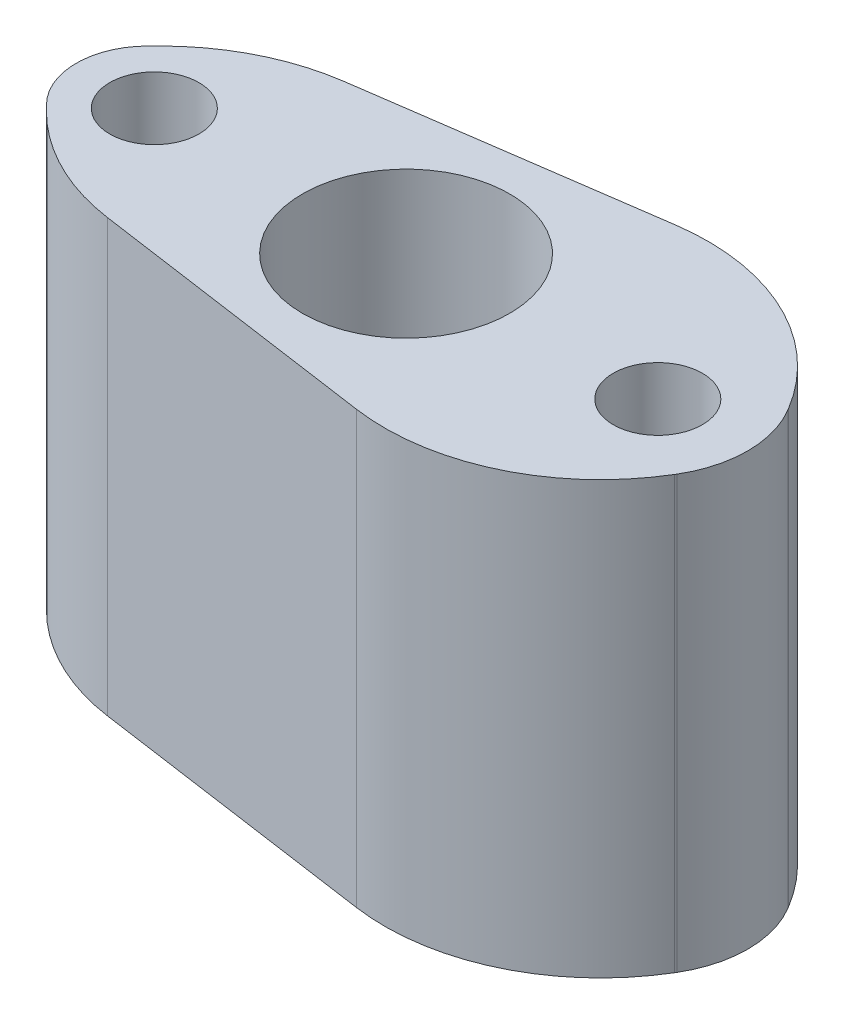
ISO-10303-21;
HEADER;
FILE_DESCRIPTION(('STEP AP214'),'2;1');
FILE_NAME('part.step','',(''),(''),'','','');
FILE_SCHEMA(('AUTOMOTIVE_DESIGN { 1 0 10303 214 1 1 1 1 }'));
ENDSEC;
DATA;
#1=APPLICATION_CONTEXT('core data for automotive mechanical design processes');
#2=APPLICATION_PROTOCOL_DEFINITION('international standard','automotive_design',2000,#1);
#3=PRODUCT_CONTEXT('',#1,'mechanical');
#4=PRODUCT('Part','Part','',(#3));
#5=PRODUCT_RELATED_PRODUCT_CATEGORY('part','',(#4));
#6=PRODUCT_DEFINITION_FORMATION('','',#4);
#7=PRODUCT_DEFINITION_CONTEXT('part definition',#1,'design');
#8=PRODUCT_DEFINITION('design','',#6,#7);
#9=PRODUCT_DEFINITION_SHAPE('','',#8);
#10=(LENGTH_UNIT() NAMED_UNIT(*) SI_UNIT(.MILLI.,.METRE.));
#11=(NAMED_UNIT(*) PLANE_ANGLE_UNIT() SI_UNIT($,.RADIAN.));
#12=(NAMED_UNIT(*) SI_UNIT($,.STERADIAN.) SOLID_ANGLE_UNIT());
#13=UNCERTAINTY_MEASURE_WITH_UNIT(LENGTH_MEASURE(1.E-05),#10,'distance_accuracy_value','');
#14=(GEOMETRIC_REPRESENTATION_CONTEXT(3) GLOBAL_UNCERTAINTY_ASSIGNED_CONTEXT((#13)) GLOBAL_UNIT_ASSIGNED_CONTEXT((#10,
#11,#12)) REPRESENTATION_CONTEXT('',''));
#15=CARTESIAN_POINT('',(0.,0.,0.));
#16=DIRECTION('',(0.,0.,1.));
#17=DIRECTION('',(1.,0.,0.));
#18=AXIS2_PLACEMENT_3D('',#15,#16,#17);
#19=CARTESIAN_POINT('',(-1.79289321881345,3.,0.));
#20=DIRECTION('',(0.,1.,0.));
#21=DIRECTION('',(0.,0.,1.));
#22=AXIS2_PLACEMENT_3D('',#19,#20,#21);
#23=PLANE('',#22);
#24=CARTESIAN_POINT('',(1.75,3.,0.));
#25=DIRECTION('',(0.,1.,0.));
#26=DIRECTION('',(0.,0.,1.));
#27=AXIS2_PLACEMENT_3D('',#24,#25,#26);
#28=CIRCLE('',#27,0.31);
#29=CARTESIAN_POINT('',(1.75,3.,0.31));
#30=VERTEX_POINT('',#29);
#31=EDGE_CURVE('E287',#30,#30,#28,.T.);
#32=ORIENTED_EDGE('',*,*,#31,.F.);
#33=EDGE_LOOP('',(#32));
#34=FACE_BOUND('',#33,.T.);
#35=CARTESIAN_POINT('',(-1.79289321881345,3.,0.));
#36=DIRECTION('',(0.,1.,0.));
#37=DIRECTION('',(0.,0.,1.));
#38=AXIS2_PLACEMENT_3D('',#35,#36,#37);
#39=CIRCLE('',#38,0.5);
#40=CARTESIAN_POINT('',(-2.14644660940672,3.,-0.353553390593276));
#41=VERTEX_POINT('',#40);
#42=CARTESIAN_POINT('',(-2.14644660940672,3.,0.353553390593276));
#43=VERTEX_POINT('',#42);
#44=EDGE_CURVE('E177',#41,#43,#39,.T.);
#45=ORIENTED_EDGE('',*,*,#44,.T.);
#46=DIRECTION('',(0.707106781186547,0.,0.707106781186548));
#47=VECTOR('',#46,1.);
#48=CARTESIAN_POINT('',(-2.14644660940672,3.,0.353553390593276));
#49=LINE('',#48,#47);
#50=CARTESIAN_POINT('',(-2.10355339059328,3.,0.396446609406722));
#51=VERTEX_POINT('',#50);
#52=EDGE_CURVE('E105',#43,#51,#49,.T.);
#53=ORIENTED_EDGE('',*,*,#52,.T.);
#54=CARTESIAN_POINT('',(-1.04289321881345,3.,-0.664213562373095));
#55=DIRECTION('',(0.,1.,0.));
#56=DIRECTION('',(0.,0.,-1.));
#57=AXIS2_PLACEMENT_3D('',#54,#55,#56);
#58=CIRCLE('',#57,1.5);
#59=CARTESIAN_POINT('',(-1.25502525316941,3.,0.820710678118656));
#60=VERTEX_POINT('',#59);
#61=EDGE_CURVE('E204',#51,#60,#58,.T.);
#62=ORIENTED_EDGE('',*,*,#61,.T.);
#63=DIRECTION('',(0.989949493661167,0.,0.141421356237309));
#64=VECTOR('',#63,1.);
#65=CARTESIAN_POINT('',(-1.25502525316941,3.,0.820710678118656));
#66=LINE('',#65,#64);
#67=CARTESIAN_POINT('',(0.764153969858593,3.,1.10916485283694));
#68=VERTEX_POINT('',#67);
#69=EDGE_CURVE('E223',#60,#68,#66,.T.);
#70=ORIENTED_EDGE('',*,*,#69,.T.);
#71=CARTESIAN_POINT('',(0.976286004214565,3.,-0.375759387654807));
#72=DIRECTION('',(0.,1.,0.));
#73=DIRECTION('',(0.,0.,-1.));
#74=AXIS2_PLACEMENT_3D('',#71,#72,#73);
#75=CIRCLE('',#74,1.5);
#76=CARTESIAN_POINT('',(2.26244834775809,3.,0.396112639335832));
#77=VERTEX_POINT('',#76);
#78=EDGE_CURVE('E220',#68,#77,#75,.T.);
#79=ORIENTED_EDGE('',*,*,#78,.T.);
#80=DIRECTION('',(0.514581351327091,0.,-0.857441562362348));
#81=VECTOR('',#80,1.);
#82=CARTESIAN_POINT('',(2.26244834775809,3.,0.396112639335832));
#83=LINE('',#82,#81);
#84=CARTESIAN_POINT('',(2.26843390504464,3.,0.386138967382589));
#85=VERTEX_POINT('',#84);
#86=EDGE_CURVE('E222',#77,#85,#83,.T.);
#87=ORIENTED_EDGE('',*,*,#86,.T.);
#88=CARTESIAN_POINT('',(1.62535273327288,3.,0.000202953887263796));
#89=DIRECTION('',(0.,1.,0.));
#90=DIRECTION('',(0.,0.,1.));
#91=AXIS2_PLACEMENT_3D('',#88,#89,#90);
#92=CIRCLE('',#91,0.75);
#93=CARTESIAN_POINT('',(2.26851386984867,3.,-0.385599783789055));
#94=VERTEX_POINT('',#93);
#95=EDGE_CURVE('E225',#85,#94,#92,.T.);
#96=ORIENTED_EDGE('',*,*,#95,.T.);
#97=DIRECTION('',(-0.514403650235082,0.,-0.857548182101055));
#98=VECTOR('',#97,1.);
#99=CARTESIAN_POINT('',(2.26851386984867,3.,-0.385599783789055));
#100=LINE('',#99,#98);
#101=CARTESIAN_POINT('',(2.26238658198034,3.,-0.395814416928416));
#102=VERTEX_POINT('',#101);
#103=EDGE_CURVE('E231',#94,#102,#100,.T.);
#104=ORIENTED_EDGE('',*,*,#103,.T.);
#105=CARTESIAN_POINT('',(0.976064308828755,3.,0.375791058424208));
#106=DIRECTION('',(0.,1.,0.));
#107=DIRECTION('',(0.,0.,1.));
#108=AXIS2_PLACEMENT_3D('',#105,#106,#107);
#109=CIRCLE('',#108,1.5);
#110=CARTESIAN_POINT('',(0.763932274472784,3.,-1.10913318206754));
#111=VERTEX_POINT('',#110);
#112=EDGE_CURVE('E136',#102,#111,#109,.T.);
#113=ORIENTED_EDGE('',*,*,#112,.T.);
#114=DIRECTION('',(-0.989949493661166,0.,0.141421356237309));
#115=VECTOR('',#114,1.);
#116=CARTESIAN_POINT('',(0.763932274472784,3.,-1.10913318206754));
#117=LINE('',#116,#115);
#118=CARTESIAN_POINT('',(-1.25502525316941,3.,-0.820710678118656));
#119=VERTEX_POINT('',#118);
#120=EDGE_CURVE('E130',#111,#119,#117,.T.);
#121=ORIENTED_EDGE('',*,*,#120,.T.);
#122=CARTESIAN_POINT('',(-1.04289321881345,3.,0.664213562373095));
#123=DIRECTION('',(0.,1.,0.));
#124=DIRECTION('',(0.,0.,1.));
#125=AXIS2_PLACEMENT_3D('',#122,#123,#124);
#126=CIRCLE('',#125,1.5);
#127=CARTESIAN_POINT('',(-2.10355339059328,3.,-0.396446609406722));
#128=VERTEX_POINT('',#127);
#129=EDGE_CURVE('E134',#119,#128,#126,.T.);
#130=ORIENTED_EDGE('',*,*,#129,.T.);
#131=DIRECTION('',(-0.707106781186547,0.,0.707106781186548));
#132=VECTOR('',#131,1.);
#133=CARTESIAN_POINT('',(-2.10355339059328,3.,-0.396446609406722));
#134=LINE('',#133,#132);
#135=EDGE_CURVE('E50',#128,#41,#134,.T.);
#136=ORIENTED_EDGE('',*,*,#135,.T.);
#137=EDGE_LOOP('',(#45,#53,#62,#70,#79,#87,#96,#104,#113,#121,#130,#136));
#138=FACE_BOUND('',#137,.T.);
#139=CARTESIAN_POINT('',(0.,3.,0.));
#140=DIRECTION('',(0.,1.,0.));
#141=DIRECTION('',(0.,0.,1.));
#142=AXIS2_PLACEMENT_3D('',#139,#140,#141);
#143=CIRCLE('',#142,0.72);
#144=CARTESIAN_POINT('',(0.,3.,0.72));
#145=VERTEX_POINT('',#144);
#146=EDGE_CURVE('E158',#145,#145,#143,.T.);
#147=ORIENTED_EDGE('',*,*,#146,.F.);
#148=EDGE_LOOP('',(#147));
#149=FACE_BOUND('',#148,.T.);
#150=CARTESIAN_POINT('',(-1.75,3.,0.));
#151=DIRECTION('',(0.,1.,0.));
#152=DIRECTION('',(0.,0.,1.));
#153=AXIS2_PLACEMENT_3D('',#150,#151,#152);
#154=CIRCLE('',#153,0.31);
#155=CARTESIAN_POINT('',(-1.75,3.,0.31));
#156=VERTEX_POINT('',#155);
#157=EDGE_CURVE('E278',#156,#156,#154,.T.);
#158=ORIENTED_EDGE('',*,*,#157,.F.);
#159=EDGE_LOOP('',(#158));
#160=FACE_BOUND('',#159,.T.);
#161=ADVANCED_FACE('F33',(#34,#138,#149,#160),#23,.T.);
#162=CARTESIAN_POINT('',(-1.79289321881345,0.,0.));
#163=DIRECTION('',(0.,1.,0.));
#164=DIRECTION('',(0.,0.,1.));
#165=AXIS2_PLACEMENT_3D('',#162,#163,#164);
#166=PLANE('',#165);
#167=CARTESIAN_POINT('',(1.75,0.,0.));
#168=DIRECTION('',(0.,1.,0.));
#169=DIRECTION('',(0.,0.,1.));
#170=AXIS2_PLACEMENT_3D('',#167,#168,#169);
#171=CIRCLE('',#170,0.31);
#172=CARTESIAN_POINT('',(1.75,0.,0.31));
#173=VERTEX_POINT('',#172);
#174=EDGE_CURVE('E284',#173,#173,#171,.T.);
#175=ORIENTED_EDGE('',*,*,#174,.T.);
#176=EDGE_LOOP('',(#175));
#177=FACE_BOUND('',#176,.T.);
#178=CARTESIAN_POINT('',(-1.79289321881345,0.,0.));
#179=DIRECTION('',(0.,1.,0.));
#180=DIRECTION('',(0.,0.,1.));
#181=AXIS2_PLACEMENT_3D('',#178,#179,#180);
#182=CIRCLE('',#181,0.5);
#183=CARTESIAN_POINT('',(-2.14644660940672,0.,-0.353553390593276));
#184=VERTEX_POINT('',#183);
#185=CARTESIAN_POINT('',(-2.14644660940672,0.,0.353553390593276));
#186=VERTEX_POINT('',#185);
#187=EDGE_CURVE('E154',#184,#186,#182,.T.);
#188=ORIENTED_EDGE('',*,*,#187,.F.);
#189=DIRECTION('',(-0.707106781186547,0.,0.707106781186548));
#190=VECTOR('',#189,1.);
#191=CARTESIAN_POINT('',(-2.10355339059328,0.,-0.396446609406722));
#192=LINE('',#191,#190);
#193=CARTESIAN_POINT('',(-2.10355339059328,0.,-0.396446609406722));
#194=VERTEX_POINT('',#193);
#195=EDGE_CURVE('E97',#194,#184,#192,.T.);
#196=ORIENTED_EDGE('',*,*,#195,.F.);
#197=CARTESIAN_POINT('',(-1.04289321881345,0.,0.664213562373095));
#198=DIRECTION('',(0.,1.,0.));
#199=DIRECTION('',(0.,0.,1.));
#200=AXIS2_PLACEMENT_3D('',#197,#198,#199);
#201=CIRCLE('',#200,1.5);
#202=CARTESIAN_POINT('',(-1.25502525316941,0.,-0.820710678118656));
#203=VERTEX_POINT('',#202);
#204=EDGE_CURVE('E91',#203,#194,#201,.T.);
#205=ORIENTED_EDGE('',*,*,#204,.F.);
#206=DIRECTION('',(-0.989949493661166,0.,0.141421356237309));
#207=VECTOR('',#206,1.);
#208=CARTESIAN_POINT('',(0.763932274472784,0.,-1.10913318206754));
#209=LINE('',#208,#207);
#210=CARTESIAN_POINT('',(0.763932274472784,0.,-1.10913318206754));
#211=VERTEX_POINT('',#210);
#212=EDGE_CURVE('E144',#211,#203,#209,.T.);
#213=ORIENTED_EDGE('',*,*,#212,.F.);
#214=CARTESIAN_POINT('',(0.976064308828755,0.,0.375791058424208));
#215=DIRECTION('',(0.,1.,0.));
#216=DIRECTION('',(0.,0.,1.));
#217=AXIS2_PLACEMENT_3D('',#214,#215,#216);
#218=CIRCLE('',#217,1.5);
#219=CARTESIAN_POINT('',(2.26238658198034,0.,-0.395814416928416));
#220=VERTEX_POINT('',#219);
#221=EDGE_CURVE('E172',#220,#211,#218,.T.);
#222=ORIENTED_EDGE('',*,*,#221,.F.);
#223=DIRECTION('',(-0.514403650235082,0.,-0.857548182101055));
#224=VECTOR('',#223,1.);
#225=CARTESIAN_POINT('',(2.26851386984867,0.,-0.385599783789055));
#226=LINE('',#225,#224);
#227=CARTESIAN_POINT('',(2.26851386984867,0.,-0.385599783789055));
#228=VERTEX_POINT('',#227);
#229=EDGE_CURVE('E170',#228,#220,#226,.T.);
#230=ORIENTED_EDGE('',*,*,#229,.F.);
#231=CARTESIAN_POINT('',(1.62535273327288,0.,0.000202953887263796));
#232=DIRECTION('',(0.,1.,0.));
#233=DIRECTION('',(0.,0.,1.));
#234=AXIS2_PLACEMENT_3D('',#231,#232,#233);
#235=CIRCLE('',#234,0.75);
#236=CARTESIAN_POINT('',(2.26843390504464,0.,0.386138967382589));
#237=VERTEX_POINT('',#236);
#238=EDGE_CURVE('E168',#237,#228,#235,.T.);
#239=ORIENTED_EDGE('',*,*,#238,.F.);
#240=DIRECTION('',(0.514581351327091,0.,-0.857441562362348));
#241=VECTOR('',#240,1.);
#242=CARTESIAN_POINT('',(2.26244834775809,0.,0.396112639335832));
#243=LINE('',#242,#241);
#244=CARTESIAN_POINT('',(2.26244834775809,0.,0.396112639335832));
#245=VERTEX_POINT('',#244);
#246=EDGE_CURVE('E166',#245,#237,#243,.T.);
#247=ORIENTED_EDGE('',*,*,#246,.F.);
#248=CARTESIAN_POINT('',(0.976286004214565,0.,-0.375759387654807));
#249=DIRECTION('',(0.,1.,0.));
#250=DIRECTION('',(0.,0.,-1.));
#251=AXIS2_PLACEMENT_3D('',#248,#249,#250);
#252=CIRCLE('',#251,1.5);
#253=CARTESIAN_POINT('',(0.764153969858593,0.,1.10916485283694));
#254=VERTEX_POINT('',#253);
#255=EDGE_CURVE('E164',#254,#245,#252,.T.);
#256=ORIENTED_EDGE('',*,*,#255,.F.);
#257=DIRECTION('',(0.989949493661167,0.,0.141421356237309));
#258=VECTOR('',#257,1.);
#259=CARTESIAN_POINT('',(-1.25502525316941,0.,0.820710678118656));
#260=LINE('',#259,#258);
#261=CARTESIAN_POINT('',(-1.25502525316941,0.,0.820710678118656));
#262=VERTEX_POINT('',#261);
#263=EDGE_CURVE('E162',#262,#254,#260,.T.);
#264=ORIENTED_EDGE('',*,*,#263,.F.);
#265=CARTESIAN_POINT('',(-1.04289321881345,0.,-0.664213562373095));
#266=DIRECTION('',(0.,1.,0.));
#267=DIRECTION('',(0.,0.,-1.));
#268=AXIS2_PLACEMENT_3D('',#265,#266,#267);
#269=CIRCLE('',#268,1.5);
#270=CARTESIAN_POINT('',(-2.10355339059328,0.,0.396446609406722));
#271=VERTEX_POINT('',#270);
#272=EDGE_CURVE('E160',#271,#262,#269,.T.);
#273=ORIENTED_EDGE('',*,*,#272,.F.);
#274=DIRECTION('',(0.707106781186547,0.,0.707106781186548));
#275=VECTOR('',#274,1.);
#276=CARTESIAN_POINT('',(-2.14644660940672,0.,0.353553390593276));
#277=LINE('',#276,#275);
#278=EDGE_CURVE('E157',#186,#271,#277,.T.);
#279=ORIENTED_EDGE('',*,*,#278,.F.);
#280=EDGE_LOOP('',(#188,#196,#205,#213,#222,#230,#239,#247,#256,#264,#273,#279));
#281=FACE_BOUND('',#280,.T.);
#282=CARTESIAN_POINT('',(0.,0.,0.));
#283=DIRECTION('',(0.,1.,0.));
#284=DIRECTION('',(0.,0.,1.));
#285=AXIS2_PLACEMENT_3D('',#282,#283,#284);
#286=CIRCLE('',#285,0.72);
#287=CARTESIAN_POINT('',(0.,0.,0.72));
#288=VERTEX_POINT('',#287);
#289=EDGE_CURVE('E290',#288,#288,#286,.T.);
#290=ORIENTED_EDGE('',*,*,#289,.T.);
#291=EDGE_LOOP('',(#290));
#292=FACE_BOUND('',#291,.T.);
#293=CARTESIAN_POINT('',(-1.75,0.,0.));
#294=DIRECTION('',(0.,1.,0.));
#295=DIRECTION('',(0.,0.,1.));
#296=AXIS2_PLACEMENT_3D('',#293,#294,#295);
#297=CIRCLE('',#296,0.31);
#298=CARTESIAN_POINT('',(-1.75,0.,0.31));
#299=VERTEX_POINT('',#298);
#300=EDGE_CURVE('E281',#299,#299,#297,.T.);
#301=ORIENTED_EDGE('',*,*,#300,.T.);
#302=EDGE_LOOP('',(#301));
#303=FACE_BOUND('',#302,.T.);
#304=ADVANCED_FACE('F208',(#177,#281,#292,#303),#166,.F.);
#305=CARTESIAN_POINT('',(-1.79289321881345,3.,0.));
#306=DIRECTION('',(0.,-1.,0.));
#307=DIRECTION('',(0.,0.,-1.));
#308=AXIS2_PLACEMENT_3D('',#305,#306,#307);
#309=CYLINDRICAL_SURFACE('',#308,0.5);
#310=ORIENTED_EDGE('',*,*,#187,.T.);
#311=DIRECTION('',(0.,-1.,0.));
#312=VECTOR('',#311,1.);
#313=CARTESIAN_POINT('',(-2.14644660940672,3.,0.353553390593276));
#314=LINE('',#313,#312);
#315=EDGE_CURVE('E11',#43,#186,#314,.T.);
#316=ORIENTED_EDGE('',*,*,#315,.F.);
#317=ORIENTED_EDGE('',*,*,#44,.F.);
#318=DIRECTION('',(0.,-1.,0.));
#319=VECTOR('',#318,1.);
#320=CARTESIAN_POINT('',(-2.14644660940672,3.,-0.353553390593276));
#321=LINE('',#320,#319);
#322=EDGE_CURVE('E150',#41,#184,#321,.T.);
#323=ORIENTED_EDGE('',*,*,#322,.T.);
#324=EDGE_LOOP('',(#310,#316,#317,#323));
#325=FACE_BOUND('',#324,.T.);
#326=ADVANCED_FACE('F35',(#325),#309,.T.);
#327=CARTESIAN_POINT('',(-2.14644660940672,3.,0.353553390593276));
#328=DIRECTION('',(0.707106781186548,0.,-0.707106781186547));
#329=DIRECTION('',(-0.707106781186547,0.,-0.707106781186548));
#330=AXIS2_PLACEMENT_3D('',#327,#328,#329);
#331=PLANE('',#330);
#332=ORIENTED_EDGE('',*,*,#278,.T.);
#333=DIRECTION('',(0.,-1.,0.));
#334=VECTOR('',#333,1.);
#335=CARTESIAN_POINT('',(-2.10355339059328,3.,0.396446609406722));
#336=LINE('',#335,#334);
#337=EDGE_CURVE('E42',#51,#271,#336,.T.);
#338=ORIENTED_EDGE('',*,*,#337,.F.);
#339=ORIENTED_EDGE('',*,*,#52,.F.);
#340=ORIENTED_EDGE('',*,*,#315,.T.);
#341=EDGE_LOOP('',(#332,#338,#339,#340));
#342=FACE_BOUND('',#341,.T.);
#343=ADVANCED_FACE('F391',(#342),#331,.F.);
#344=CARTESIAN_POINT('',(-1.04289321881345,3.,-0.664213562373095));
#345=DIRECTION('',(0.,-1.,0.));
#346=DIRECTION('',(0.,0.,-1.));
#347=AXIS2_PLACEMENT_3D('',#344,#345,#346);
#348=CYLINDRICAL_SURFACE('',#347,1.5);
#349=ORIENTED_EDGE('',*,*,#272,.T.);
#350=DIRECTION('',(0.,-1.,0.));
#351=VECTOR('',#350,1.);
#352=CARTESIAN_POINT('',(-1.25502525316941,3.,0.820710678118656));
#353=LINE('',#352,#351);
#354=EDGE_CURVE('E196',#60,#262,#353,.T.);
#355=ORIENTED_EDGE('',*,*,#354,.F.);
#356=ORIENTED_EDGE('',*,*,#61,.F.);
#357=ORIENTED_EDGE('',*,*,#337,.T.);
#358=EDGE_LOOP('',(#349,#355,#356,#357));
#359=FACE_BOUND('',#358,.T.);
#360=ADVANCED_FACE('F202',(#359),#348,.T.);
#361=CARTESIAN_POINT('',(-1.25502525316941,3.,0.820710678118656));
#362=DIRECTION('',(0.141421356237309,0.,-0.989949493661167));
#363=DIRECTION('',(-0.989949493661167,0.,-0.141421356237309));
#364=AXIS2_PLACEMENT_3D('',#361,#362,#363);
#365=PLANE('',#364);
#366=ORIENTED_EDGE('',*,*,#263,.T.);
#367=DIRECTION('',(0.,-1.,0.));
#368=VECTOR('',#367,1.);
#369=CARTESIAN_POINT('',(0.764153969858593,3.,1.10916485283694));
#370=LINE('',#369,#368);
#371=EDGE_CURVE('E193',#68,#254,#370,.T.);
#372=ORIENTED_EDGE('',*,*,#371,.F.);
#373=ORIENTED_EDGE('',*,*,#69,.F.);
#374=ORIENTED_EDGE('',*,*,#354,.T.);
#375=EDGE_LOOP('',(#366,#372,#373,#374));
#376=FACE_BOUND('',#375,.T.);
#377=ADVANCED_FACE('F214',(#376),#365,.F.);
#378=CARTESIAN_POINT('',(0.976286004214565,3.,-0.375759387654807));
#379=DIRECTION('',(0.,-1.,0.));
#380=DIRECTION('',(0.,0.,-1.));
#381=AXIS2_PLACEMENT_3D('',#378,#379,#380);
#382=CYLINDRICAL_SURFACE('',#381,1.5);
#383=ORIENTED_EDGE('',*,*,#255,.T.);
#384=DIRECTION('',(0.,-1.,0.));
#385=VECTOR('',#384,1.);
#386=CARTESIAN_POINT('',(2.26244834775809,3.,0.396112639335832));
#387=LINE('',#386,#385);
#388=EDGE_CURVE('E190',#77,#245,#387,.T.);
#389=ORIENTED_EDGE('',*,*,#388,.F.);
#390=ORIENTED_EDGE('',*,*,#78,.F.);
#391=ORIENTED_EDGE('',*,*,#371,.T.);
#392=EDGE_LOOP('',(#383,#389,#390,#391));
#393=FACE_BOUND('',#392,.T.);
#394=ADVANCED_FACE('F218',(#393),#382,.T.);
#395=CARTESIAN_POINT('',(2.26244834775809,3.,0.396112639335832));
#396=DIRECTION('',(-0.857441562362348,0.,-0.514581351327091));
#397=DIRECTION('',(-0.514581351327091,0.,0.857441562362348));
#398=AXIS2_PLACEMENT_3D('',#395,#396,#397);
#399=PLANE('',#398);
#400=ORIENTED_EDGE('',*,*,#246,.T.);
#401=DIRECTION('',(0.,-1.,0.));
#402=VECTOR('',#401,1.);
#403=CARTESIAN_POINT('',(2.26843390504464,3.,0.386138967382589));
#404=LINE('',#403,#402);
#405=EDGE_CURVE('E187',#85,#237,#404,.T.);
#406=ORIENTED_EDGE('',*,*,#405,.F.);
#407=ORIENTED_EDGE('',*,*,#86,.F.);
#408=ORIENTED_EDGE('',*,*,#388,.T.);
#409=EDGE_LOOP('',(#400,#406,#407,#408));
#410=FACE_BOUND('',#409,.T.);
#411=ADVANCED_FACE('F356',(#410),#399,.F.);
#412=CARTESIAN_POINT('',(1.62535273327288,3.,0.000202953887263796));
#413=DIRECTION('',(0.,-1.,0.));
#414=DIRECTION('',(0.,0.,-1.));
#415=AXIS2_PLACEMENT_3D('',#412,#413,#414);
#416=CYLINDRICAL_SURFACE('',#415,0.75);
#417=ORIENTED_EDGE('',*,*,#238,.T.);
#418=DIRECTION('',(0.,-1.,0.));
#419=VECTOR('',#418,1.);
#420=CARTESIAN_POINT('',(2.26851386984867,3.,-0.385599783789055));
#421=LINE('',#420,#419);
#422=EDGE_CURVE('E184',#94,#228,#421,.T.);
#423=ORIENTED_EDGE('',*,*,#422,.F.);
#424=ORIENTED_EDGE('',*,*,#95,.F.);
#425=ORIENTED_EDGE('',*,*,#405,.T.);
#426=EDGE_LOOP('',(#417,#423,#424,#425));
#427=FACE_BOUND('',#426,.T.);
#428=ADVANCED_FACE('F347',(#427),#416,.T.);
#429=CARTESIAN_POINT('',(2.26851386984867,3.,-0.385599783789055));
#430=DIRECTION('',(-0.857548182101055,0.,0.514403650235081));
#431=DIRECTION('',(0.514403650235082,0.,0.857548182101055));
#432=AXIS2_PLACEMENT_3D('',#429,#430,#431);
#433=PLANE('',#432);
#434=ORIENTED_EDGE('',*,*,#229,.T.);
#435=DIRECTION('',(0.,-1.,0.));
#436=VECTOR('',#435,1.);
#437=CARTESIAN_POINT('',(2.26238658198034,3.,-0.395814416928416));
#438=LINE('',#437,#436);
#439=EDGE_CURVE('E181',#102,#220,#438,.T.);
#440=ORIENTED_EDGE('',*,*,#439,.F.);
#441=ORIENTED_EDGE('',*,*,#103,.F.);
#442=ORIENTED_EDGE('',*,*,#422,.T.);
#443=EDGE_LOOP('',(#434,#440,#441,#442));
#444=FACE_BOUND('',#443,.T.);
#445=ADVANCED_FACE('F237',(#444),#433,.F.);
#446=CARTESIAN_POINT('',(0.976064308828755,3.,0.375791058424208));
#447=DIRECTION('',(0.,-1.,0.));
#448=DIRECTION('',(0.,0.,-1.));
#449=AXIS2_PLACEMENT_3D('',#446,#447,#448);
#450=CYLINDRICAL_SURFACE('',#449,1.5);
#451=ORIENTED_EDGE('',*,*,#221,.T.);
#452=DIRECTION('',(0.,-1.,0.));
#453=VECTOR('',#452,1.);
#454=CARTESIAN_POINT('',(0.763932274472784,3.,-1.10913318206754));
#455=LINE('',#454,#453);
#456=EDGE_CURVE('E145',#111,#211,#455,.T.);
#457=ORIENTED_EDGE('',*,*,#456,.F.);
#458=ORIENTED_EDGE('',*,*,#112,.F.);
#459=ORIENTED_EDGE('',*,*,#439,.T.);
#460=EDGE_LOOP('',(#451,#457,#458,#459));
#461=FACE_BOUND('',#460,.T.);
#462=ADVANCED_FACE('F241',(#461),#450,.T.);
#463=CARTESIAN_POINT('',(0.763932274472784,3.,-1.10913318206754));
#464=DIRECTION('',(0.141421356237309,0.,0.989949493661167));
#465=DIRECTION('',(0.989949493661167,0.,-0.141421356237309));
#466=AXIS2_PLACEMENT_3D('',#463,#464,#465);
#467=PLANE('',#466);
#468=ORIENTED_EDGE('',*,*,#212,.T.);
#469=DIRECTION('',(0.,-1.,0.));
#470=VECTOR('',#469,1.);
#471=CARTESIAN_POINT('',(-1.25502525316941,3.,-0.820710678118656));
#472=LINE('',#471,#470);
#473=EDGE_CURVE('E141',#119,#203,#472,.T.);
#474=ORIENTED_EDGE('',*,*,#473,.F.);
#475=ORIENTED_EDGE('',*,*,#120,.F.);
#476=ORIENTED_EDGE('',*,*,#456,.T.);
#477=EDGE_LOOP('',(#468,#474,#475,#476));
#478=FACE_BOUND('',#477,.T.);
#479=ADVANCED_FACE('F142',(#478),#467,.F.);
#480=CARTESIAN_POINT('',(-1.04289321881345,3.,0.664213562373095));
#481=DIRECTION('',(0.,-1.,0.));
#482=DIRECTION('',(0.,0.,-1.));
#483=AXIS2_PLACEMENT_3D('',#480,#481,#482);
#484=CYLINDRICAL_SURFACE('',#483,1.5);
#485=ORIENTED_EDGE('',*,*,#204,.T.);
#486=DIRECTION('',(0.,-1.,0.));
#487=VECTOR('',#486,1.);
#488=CARTESIAN_POINT('',(-2.10355339059328,3.,-0.396446609406722));
#489=LINE('',#488,#487);
#490=EDGE_CURVE('E146',#128,#194,#489,.T.);
#491=ORIENTED_EDGE('',*,*,#490,.F.);
#492=ORIENTED_EDGE('',*,*,#129,.F.);
#493=ORIENTED_EDGE('',*,*,#473,.T.);
#494=EDGE_LOOP('',(#485,#491,#492,#493));
#495=FACE_BOUND('',#494,.T.);
#496=ADVANCED_FACE('F148',(#495),#484,.T.);
#497=CARTESIAN_POINT('',(-2.10355339059328,3.,-0.396446609406722));
#498=DIRECTION('',(0.707106781186548,0.,0.707106781186547));
#499=DIRECTION('',(0.707106781186547,0.,-0.707106781186548));
#500=AXIS2_PLACEMENT_3D('',#497,#498,#499);
#501=PLANE('',#500);
#502=ORIENTED_EDGE('',*,*,#195,.T.);
#503=ORIENTED_EDGE('',*,*,#322,.F.);
#504=ORIENTED_EDGE('',*,*,#135,.F.);
#505=ORIENTED_EDGE('',*,*,#490,.T.);
#506=EDGE_LOOP('',(#502,#503,#504,#505));
#507=FACE_BOUND('',#506,.T.);
#508=ADVANCED_FACE('F245',(#507),#501,.F.);
#509=CARTESIAN_POINT('',(0.,3.,0.));
#510=DIRECTION('',(0.,-1.,0.));
#511=DIRECTION('',(0.,0.,-1.));
#512=AXIS2_PLACEMENT_3D('',#509,#510,#511);
#513=CYLINDRICAL_SURFACE('',#512,0.72);
#514=ORIENTED_EDGE('',*,*,#146,.T.);
#515=EDGE_LOOP('',(#514));
#516=FACE_BOUND('',#515,.T.);
#517=ORIENTED_EDGE('',*,*,#289,.F.);
#518=EDGE_LOOP('',(#517));
#519=FACE_BOUND('',#518,.T.);
#520=ADVANCED_FACE('F247',(#516,#519),#513,.F.);
#521=CARTESIAN_POINT('',(1.75,3.,0.));
#522=DIRECTION('',(0.,-1.,0.));
#523=DIRECTION('',(0.,0.,-1.));
#524=AXIS2_PLACEMENT_3D('',#521,#522,#523);
#525=CYLINDRICAL_SURFACE('',#524,0.31);
#526=ORIENTED_EDGE('',*,*,#31,.T.);
#527=EDGE_LOOP('',(#526));
#528=FACE_BOUND('',#527,.T.);
#529=ORIENTED_EDGE('',*,*,#174,.F.);
#530=EDGE_LOOP('',(#529));
#531=FACE_BOUND('',#530,.T.);
#532=ADVANCED_FACE('F253',(#528,#531),#525,.F.);
#533=CARTESIAN_POINT('',(-1.75,3.,0.));
#534=DIRECTION('',(0.,-1.,0.));
#535=DIRECTION('',(0.,0.,-1.));
#536=AXIS2_PLACEMENT_3D('',#533,#534,#535);
#537=CYLINDRICAL_SURFACE('',#536,0.31);
#538=ORIENTED_EDGE('',*,*,#157,.T.);
#539=EDGE_LOOP('',(#538));
#540=FACE_BOUND('',#539,.T.);
#541=ORIENTED_EDGE('',*,*,#300,.F.);
#542=EDGE_LOOP('',(#541));
#543=FACE_BOUND('',#542,.T.);
#544=ADVANCED_FACE('F269',(#540,#543),#537,.F.);
#545=CLOSED_SHELL('',(#161,#304,#326,#343,#360,#377,#394,#411,#428,#445,#462,#479,#496,#508,
#520,#532,#544));
#546=MANIFOLD_SOLID_BREP('B2',#545);
#547=ADVANCED_BREP_SHAPE_REPRESENTATION('',(#18,#546),#14);
#548=SHAPE_DEFINITION_REPRESENTATION(#9,#547);
ENDSEC;
END-ISO-10303-21;
